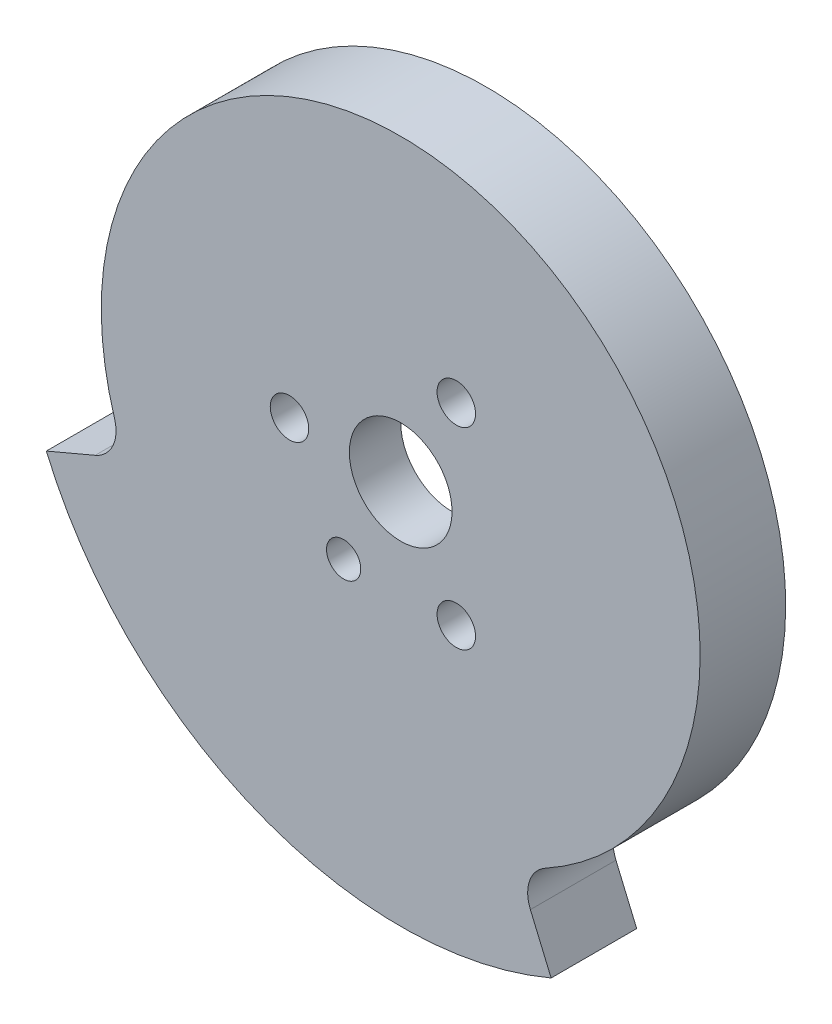
ISO-10303-21;
HEADER;
FILE_DESCRIPTION(('STEP AP214'),'2;1');
FILE_NAME('part.step','',(''),(''),'','','');
FILE_SCHEMA(('AUTOMOTIVE_DESIGN { 1 0 10303 214 1 1 1 1 }'));
ENDSEC;
DATA;
#1=APPLICATION_CONTEXT('core data for automotive mechanical design processes');
#2=APPLICATION_PROTOCOL_DEFINITION('international standard','automotive_design',2000,#1);
#3=PRODUCT_CONTEXT('',#1,'mechanical');
#4=PRODUCT('Part','Part','',(#3));
#5=PRODUCT_RELATED_PRODUCT_CATEGORY('part','',(#4));
#6=PRODUCT_DEFINITION_FORMATION('','',#4);
#7=PRODUCT_DEFINITION_CONTEXT('part definition',#1,'design');
#8=PRODUCT_DEFINITION('design','',#6,#7);
#9=PRODUCT_DEFINITION_SHAPE('','',#8);
#10=(LENGTH_UNIT() NAMED_UNIT(*) SI_UNIT(.MILLI.,.METRE.));
#11=(NAMED_UNIT(*) PLANE_ANGLE_UNIT() SI_UNIT($,.RADIAN.));
#12=(NAMED_UNIT(*) SI_UNIT($,.STERADIAN.) SOLID_ANGLE_UNIT());
#13=UNCERTAINTY_MEASURE_WITH_UNIT(LENGTH_MEASURE(1.E-05),#10,'distance_accuracy_value','');
#14=(GEOMETRIC_REPRESENTATION_CONTEXT(3) GLOBAL_UNCERTAINTY_ASSIGNED_CONTEXT((#13)) GLOBAL_UNIT_ASSIGNED_CONTEXT((#10,
#11,#12)) REPRESENTATION_CONTEXT('',''));
#15=CARTESIAN_POINT('',(0.,0.,0.));
#16=DIRECTION('',(0.,0.,1.));
#17=DIRECTION('',(1.,0.,0.));
#18=AXIS2_PLACEMENT_3D('',#15,#16,#17);
#19=CARTESIAN_POINT('',(-13.,0.,10.));
#20=DIRECTION('',(0.,0.,-1.));
#21=DIRECTION('',(-1.,0.,0.));
#22=AXIS2_PLACEMENT_3D('',#19,#20,#21);
#23=CYLINDRICAL_SURFACE('',#22,2.25);
#24=CARTESIAN_POINT('',(-13.,0.,10.));
#25=DIRECTION('',(0.,0.,1.));
#26=DIRECTION('',(1.,0.,0.));
#27=AXIS2_PLACEMENT_3D('',#24,#25,#26);
#28=CIRCLE('',#27,2.25);
#29=CARTESIAN_POINT('',(-10.75,0.,10.));
#30=VERTEX_POINT('',#29);
#31=EDGE_CURVE('E106',#30,#30,#28,.T.);
#32=ORIENTED_EDGE('',*,*,#31,.T.);
#33=EDGE_LOOP('',(#32));
#34=FACE_BOUND('',#33,.T.);
#35=CARTESIAN_POINT('',(-13.,0.,4.));
#36=DIRECTION('',(0.,0.,-1.));
#37=DIRECTION('',(-1.,0.,0.));
#38=AXIS2_PLACEMENT_3D('',#35,#36,#37);
#39=CIRCLE('',#38,2.25);
#40=CARTESIAN_POINT('',(-15.25,0.,4.));
#41=VERTEX_POINT('',#40);
#42=EDGE_CURVE('E204',#41,#41,#39,.T.);
#43=ORIENTED_EDGE('',*,*,#42,.T.);
#44=EDGE_LOOP('',(#43));
#45=FACE_BOUND('',#44,.T.);
#46=ADVANCED_FACE('F34',(#34,#45),#23,.F.);
#47=CARTESIAN_POINT('',(6.49999999999997,11.2583302491977,10.));
#48=DIRECTION('',(0.,0.,-1.));
#49=DIRECTION('',(-1.,0.,0.));
#50=AXIS2_PLACEMENT_3D('',#47,#48,#49);
#51=CYLINDRICAL_SURFACE('',#50,2.25);
#52=CARTESIAN_POINT('',(6.49999999999997,11.2583302491977,10.));
#53=DIRECTION('',(0.,0.,1.));
#54=DIRECTION('',(1.,0.,0.));
#55=AXIS2_PLACEMENT_3D('',#52,#53,#54);
#56=CIRCLE('',#55,2.25);
#57=CARTESIAN_POINT('',(8.74999999999997,11.2583302491977,10.));
#58=VERTEX_POINT('',#57);
#59=EDGE_CURVE('E109',#58,#58,#56,.T.);
#60=ORIENTED_EDGE('',*,*,#59,.T.);
#61=EDGE_LOOP('',(#60));
#62=FACE_BOUND('',#61,.T.);
#63=CARTESIAN_POINT('',(6.49999999999997,11.2583302491977,4.));
#64=DIRECTION('',(0.,0.,-1.));
#65=DIRECTION('',(-1.,0.,0.));
#66=AXIS2_PLACEMENT_3D('',#63,#64,#65);
#67=CIRCLE('',#66,2.25);
#68=CARTESIAN_POINT('',(4.24999999999997,11.2583302491977,4.));
#69=VERTEX_POINT('',#68);
#70=EDGE_CURVE('E207',#69,#69,#67,.T.);
#71=ORIENTED_EDGE('',*,*,#70,.T.);
#72=EDGE_LOOP('',(#71));
#73=FACE_BOUND('',#72,.T.);
#74=ADVANCED_FACE('F167',(#62,#73),#51,.F.);
#75=CARTESIAN_POINT('',(6.49999999999998,-11.2583302491977,10.));
#76=DIRECTION('',(0.,0.,-1.));
#77=DIRECTION('',(-1.,0.,0.));
#78=AXIS2_PLACEMENT_3D('',#75,#76,#77);
#79=CYLINDRICAL_SURFACE('',#78,2.25);
#80=CARTESIAN_POINT('',(6.49999999999998,-11.2583302491977,10.));
#81=DIRECTION('',(0.,0.,1.));
#82=DIRECTION('',(1.,0.,0.));
#83=AXIS2_PLACEMENT_3D('',#80,#81,#82);
#84=CIRCLE('',#83,2.25);
#85=CARTESIAN_POINT('',(8.74999999999998,-11.2583302491977,10.));
#86=VERTEX_POINT('',#85);
#87=EDGE_CURVE('E196',#86,#86,#84,.T.);
#88=ORIENTED_EDGE('',*,*,#87,.T.);
#89=EDGE_LOOP('',(#88));
#90=FACE_BOUND('',#89,.T.);
#91=CARTESIAN_POINT('',(6.49999999999998,-11.2583302491977,4.));
#92=DIRECTION('',(0.,0.,-1.));
#93=DIRECTION('',(-1.,0.,0.));
#94=AXIS2_PLACEMENT_3D('',#91,#92,#93);
#95=CIRCLE('',#94,2.25);
#96=CARTESIAN_POINT('',(4.24999999999998,-11.2583302491977,4.));
#97=VERTEX_POINT('',#96);
#98=EDGE_CURVE('E210',#97,#97,#95,.T.);
#99=ORIENTED_EDGE('',*,*,#98,.T.);
#100=EDGE_LOOP('',(#99));
#101=FACE_BOUND('',#100,.T.);
#102=ADVANCED_FACE('F173',(#90,#101),#79,.F.);
#103=CARTESIAN_POINT('',(0.,0.,10.));
#104=DIRECTION('',(0.,0.,-1.));
#105=DIRECTION('',(-1.,0.,0.));
#106=AXIS2_PLACEMENT_3D('',#103,#104,#105);
#107=CYLINDRICAL_SURFACE('',#106,6.);
#108=CARTESIAN_POINT('',(0.,0.,10.));
#109=DIRECTION('',(0.,0.,1.));
#110=DIRECTION('',(1.,0.,0.));
#111=AXIS2_PLACEMENT_3D('',#108,#109,#110);
#112=CIRCLE('',#111,6.);
#113=CARTESIAN_POINT('',(6.,0.,10.));
#114=VERTEX_POINT('',#113);
#115=EDGE_CURVE('E193',#114,#114,#112,.T.);
#116=ORIENTED_EDGE('',*,*,#115,.T.);
#117=EDGE_LOOP('',(#116));
#118=FACE_BOUND('',#117,.T.);
#119=CARTESIAN_POINT('',(0.,0.,4.));
#120=DIRECTION('',(0.,0.,-1.));
#121=DIRECTION('',(-1.,0.,0.));
#122=AXIS2_PLACEMENT_3D('',#119,#120,#121);
#123=CIRCLE('',#122,6.);
#124=CARTESIAN_POINT('',(-6.,0.,4.));
#125=VERTEX_POINT('',#124);
#126=EDGE_CURVE('E213',#125,#125,#123,.T.);
#127=ORIENTED_EDGE('',*,*,#126,.T.);
#128=EDGE_LOOP('',(#127));
#129=FACE_BOUND('',#128,.T.);
#130=ADVANCED_FACE('F187',(#118,#129),#107,.F.);
#131=CARTESIAN_POINT('',(-6.67012731053906,-11.1583780927696,10.));
#132=DIRECTION('',(0.,0.,-1.));
#133=DIRECTION('',(-1.,0.,0.));
#134=AXIS2_PLACEMENT_3D('',#131,#132,#133);
#135=CYLINDRICAL_SURFACE('',#134,2.);
#136=CARTESIAN_POINT('',(-6.67012731053906,-11.1583780927696,10.));
#137=DIRECTION('',(0.,0.,1.));
#138=DIRECTION('',(1.,0.,0.));
#139=AXIS2_PLACEMENT_3D('',#136,#137,#138);
#140=CIRCLE('',#139,2.);
#141=CARTESIAN_POINT('',(-4.67012731053906,-11.1583780927696,10.));
#142=VERTEX_POINT('',#141);
#143=EDGE_CURVE('E201',#142,#142,#140,.T.);
#144=ORIENTED_EDGE('',*,*,#143,.T.);
#145=EDGE_LOOP('',(#144));
#146=FACE_BOUND('',#145,.T.);
#147=CARTESIAN_POINT('',(-6.67012731053906,-11.1583780927696,4.));
#148=DIRECTION('',(0.,0.,-1.));
#149=DIRECTION('',(-1.,0.,0.));
#150=AXIS2_PLACEMENT_3D('',#147,#148,#149);
#151=CIRCLE('',#150,2.);
#152=CARTESIAN_POINT('',(-8.67012731053907,-11.1583780927696,4.));
#153=VERTEX_POINT('',#152);
#154=EDGE_CURVE('E38',#153,#153,#151,.T.);
#155=ORIENTED_EDGE('',*,*,#154,.T.);
#156=EDGE_LOOP('',(#155));
#157=FACE_BOUND('',#156,.T.);
#158=ADVANCED_FACE('F182',(#146,#157),#135,.F.);
#159=CARTESIAN_POINT('',(-37.2732930890698,-11.4761327238884,10.));
#160=DIRECTION('',(0.,0.,-1.));
#161=DIRECTION('',(-1.,0.,0.));
#162=AXIS2_PLACEMENT_3D('',#159,#160,#161);
#163=PLANE('',#162);
#164=ORIENTED_EDGE('',*,*,#115,.F.);
#165=EDGE_LOOP('',(#164));
#166=FACE_BOUND('',#165,.T.);
#167=ORIENTED_EDGE('',*,*,#59,.F.);
#168=EDGE_LOOP('',(#167));
#169=FACE_BOUND('',#168,.T.);
#170=CARTESIAN_POINT('',(-37.2732930890698,-11.4761327238884,10.));
#171=DIRECTION('',(0.,0.,-1.));
#172=DIRECTION('',(-1.,0.,0.));
#173=AXIS2_PLACEMENT_3D('',#170,#171,#172);
#174=CIRCLE('',#173,4.);
#175=CARTESIAN_POINT('',(-33.4503912337806,-10.2990934701562,10.));
#176=VERTEX_POINT('',#175);
#177=CARTESIAN_POINT('',(-35.7103685751127,-15.1581521376981,10.));
#178=VERTEX_POINT('',#177);
#179=EDGE_CURVE('E120',#176,#178,#174,.T.);
#180=ORIENTED_EDGE('',*,*,#179,.T.);
#181=DIRECTION('',(-0.920504853452441,-0.390731128489271,0.));
#182=VECTOR('',#181,1.);
#183=CARTESIAN_POINT('',(-35.7103685751127,-15.1581521376981,10.));
#184=LINE('',#183,#182);
#185=CARTESIAN_POINT('',(-41.4227184053599,-17.5829007820172,10.));
#186=VERTEX_POINT('',#185);
#187=EDGE_CURVE('E101',#178,#186,#184,.T.);
#188=ORIENTED_EDGE('',*,*,#187,.T.);
#189=CARTESIAN_POINT('',(0.,0.,10.));
#190=DIRECTION('',(0.,0.,1.));
#191=DIRECTION('',(1.,0.,0.));
#192=AXIS2_PLACEMENT_3D('',#189,#190,#191);
#193=CIRCLE('',#192,45.);
#194=CARTESIAN_POINT('',(17.5829007820172,-41.4227184053599,10.));
#195=VERTEX_POINT('',#194);
#196=EDGE_CURVE('E123',#186,#195,#193,.T.);
#197=ORIENTED_EDGE('',*,*,#196,.T.);
#198=DIRECTION('',(-0.390731128489271,0.920504853452441,0.));
#199=VECTOR('',#198,1.);
#200=CARTESIAN_POINT('',(15.1581521376981,-35.7103685751127,10.));
#201=LINE('',#200,#199);
#202=CARTESIAN_POINT('',(15.1581521376981,-35.7103685751127,10.));
#203=VERTEX_POINT('',#202);
#204=EDGE_CURVE('E125',#195,#203,#201,.T.);
#205=ORIENTED_EDGE('',*,*,#204,.T.);
#206=CARTESIAN_POINT('',(18.8401715515079,-34.1474440611556,10.));
#207=DIRECTION('',(0.,0.,-1.));
#208=DIRECTION('',(1.,0.,0.));
#209=AXIS2_PLACEMENT_3D('',#206,#207,#208);
#210=CIRCLE('',#209,4.);
#211=CARTESIAN_POINT('',(16.9078462641737,-30.6451421061653,10.));
#212=VERTEX_POINT('',#211);
#213=EDGE_CURVE('E55',#203,#212,#210,.T.);
#214=ORIENTED_EDGE('',*,*,#213,.T.);
#215=CARTESIAN_POINT('',(0.,0.,10.));
#216=DIRECTION('',(0.,0.,1.));
#217=DIRECTION('',(1.,0.,0.));
#218=AXIS2_PLACEMENT_3D('',#215,#216,#217);
#219=CIRCLE('',#218,35.);
#220=EDGE_CURVE('E50',#212,#176,#219,.T.);
#221=ORIENTED_EDGE('',*,*,#220,.T.);
#222=EDGE_LOOP('',(#180,#188,#197,#205,#214,#221));
#223=FACE_BOUND('',#222,.T.);
#224=ORIENTED_EDGE('',*,*,#31,.F.);
#225=EDGE_LOOP('',(#224));
#226=FACE_BOUND('',#225,.T.);
#227=ORIENTED_EDGE('',*,*,#87,.F.);
#228=EDGE_LOOP('',(#227));
#229=FACE_BOUND('',#228,.T.);
#230=ORIENTED_EDGE('',*,*,#143,.F.);
#231=EDGE_LOOP('',(#230));
#232=FACE_BOUND('',#231,.T.);
#233=ADVANCED_FACE('F144',(#166,#169,#223,#226,#229,#232),#163,.F.);
#234=CARTESIAN_POINT('',(-37.2732930890698,-11.4761327238884,0.));
#235=DIRECTION('',(0.,0.,-1.));
#236=DIRECTION('',(-1.,0.,0.));
#237=AXIS2_PLACEMENT_3D('',#234,#235,#236);
#238=PLANE('',#237);
#239=CARTESIAN_POINT('',(0.,0.,0.));
#240=DIRECTION('',(0.,0.,-1.));
#241=DIRECTION('',(-1.,0.,0.));
#242=AXIS2_PLACEMENT_3D('',#239,#240,#241);
#243=CIRCLE('',#242,25.);
#244=CARTESIAN_POINT('',(-25.,0.,0.));
#245=VERTEX_POINT('',#244);
#246=EDGE_CURVE('E219',#245,#245,#243,.T.);
#247=ORIENTED_EDGE('',*,*,#246,.F.);
#248=EDGE_LOOP('',(#247));
#249=FACE_BOUND('',#248,.T.);
#250=CARTESIAN_POINT('',(-37.2732930890698,-11.4761327238884,0.));
#251=DIRECTION('',(0.,0.,-1.));
#252=DIRECTION('',(-1.,0.,0.));
#253=AXIS2_PLACEMENT_3D('',#250,#251,#252);
#254=CIRCLE('',#253,4.);
#255=CARTESIAN_POINT('',(-33.4503912337806,-10.2990934701562,0.));
#256=VERTEX_POINT('',#255);
#257=CARTESIAN_POINT('',(-35.7103685751127,-15.1581521376981,0.));
#258=VERTEX_POINT('',#257);
#259=EDGE_CURVE('E92',#256,#258,#254,.T.);
#260=ORIENTED_EDGE('',*,*,#259,.F.);
#261=CARTESIAN_POINT('',(0.,0.,0.));
#262=DIRECTION('',(0.,0.,1.));
#263=DIRECTION('',(1.,0.,0.));
#264=AXIS2_PLACEMENT_3D('',#261,#262,#263);
#265=CIRCLE('',#264,35.);
#266=CARTESIAN_POINT('',(16.9078462641737,-30.6451421061653,0.));
#267=VERTEX_POINT('',#266);
#268=EDGE_CURVE('E118',#267,#256,#265,.T.);
#269=ORIENTED_EDGE('',*,*,#268,.F.);
#270=CARTESIAN_POINT('',(18.8401715515079,-34.1474440611556,0.));
#271=DIRECTION('',(0.,0.,-1.));
#272=DIRECTION('',(1.,0.,0.));
#273=AXIS2_PLACEMENT_3D('',#270,#271,#272);
#274=CIRCLE('',#273,4.);
#275=CARTESIAN_POINT('',(15.1581521376981,-35.7103685751127,0.));
#276=VERTEX_POINT('',#275);
#277=EDGE_CURVE('E116',#276,#267,#274,.T.);
#278=ORIENTED_EDGE('',*,*,#277,.F.);
#279=DIRECTION('',(-0.390731128489271,0.920504853452441,0.));
#280=VECTOR('',#279,1.);
#281=CARTESIAN_POINT('',(15.1581521376981,-35.7103685751127,0.));
#282=LINE('',#281,#280);
#283=CARTESIAN_POINT('',(17.5829007820172,-41.4227184053599,0.));
#284=VERTEX_POINT('',#283);
#285=EDGE_CURVE('E114',#284,#276,#282,.T.);
#286=ORIENTED_EDGE('',*,*,#285,.F.);
#287=CARTESIAN_POINT('',(0.,0.,0.));
#288=DIRECTION('',(0.,0.,1.));
#289=DIRECTION('',(1.,0.,0.));
#290=AXIS2_PLACEMENT_3D('',#287,#288,#289);
#291=CIRCLE('',#290,45.);
#292=CARTESIAN_POINT('',(-41.4227184053599,-17.5829007820172,0.));
#293=VERTEX_POINT('',#292);
#294=EDGE_CURVE('E94',#293,#284,#291,.T.);
#295=ORIENTED_EDGE('',*,*,#294,.F.);
#296=DIRECTION('',(-0.920504853452441,-0.390731128489271,0.));
#297=VECTOR('',#296,1.);
#298=CARTESIAN_POINT('',(-35.7103685751127,-15.1581521376981,0.));
#299=LINE('',#298,#297);
#300=EDGE_CURVE('E88',#258,#293,#299,.T.);
#301=ORIENTED_EDGE('',*,*,#300,.F.);
#302=EDGE_LOOP('',(#260,#269,#278,#286,#295,#301));
#303=FACE_BOUND('',#302,.T.);
#304=ADVANCED_FACE('F89',(#249,#303),#238,.T.);
#305=CARTESIAN_POINT('',(-37.2732930890698,-11.4761327238884,10.));
#306=DIRECTION('',(0.,0.,-1.));
#307=DIRECTION('',(-1.,0.,0.));
#308=AXIS2_PLACEMENT_3D('',#305,#306,#307);
#309=CYLINDRICAL_SURFACE('',#308,4.);
#310=ORIENTED_EDGE('',*,*,#259,.T.);
#311=DIRECTION('',(0.,0.,-1.));
#312=VECTOR('',#311,1.);
#313=CARTESIAN_POINT('',(-35.7103685751127,-15.1581521376981,10.));
#314=LINE('',#313,#312);
#315=EDGE_CURVE('E11',#178,#258,#314,.T.);
#316=ORIENTED_EDGE('',*,*,#315,.F.);
#317=ORIENTED_EDGE('',*,*,#179,.F.);
#318=DIRECTION('',(0.,0.,-1.));
#319=VECTOR('',#318,1.);
#320=CARTESIAN_POINT('',(-33.4503912337806,-10.2990934701562,10.));
#321=LINE('',#320,#319);
#322=EDGE_CURVE('E105',#176,#256,#321,.T.);
#323=ORIENTED_EDGE('',*,*,#322,.T.);
#324=EDGE_LOOP('',(#310,#316,#317,#323));
#325=FACE_BOUND('',#324,.T.);
#326=ADVANCED_FACE('F36',(#325),#309,.F.);
#327=CARTESIAN_POINT('',(-35.7103685751127,-15.1581521376981,10.));
#328=DIRECTION('',(0.390731128489271,-0.920504853452441,0.));
#329=DIRECTION('',(0.920504853452441,0.390731128489271,0.));
#330=AXIS2_PLACEMENT_3D('',#327,#328,#329);
#331=PLANE('',#330);
#332=ORIENTED_EDGE('',*,*,#300,.T.);
#333=DIRECTION('',(0.,0.,-1.));
#334=VECTOR('',#333,1.);
#335=CARTESIAN_POINT('',(-41.4227184053599,-17.5829007820172,10.));
#336=LINE('',#335,#334);
#337=EDGE_CURVE('E43',#186,#293,#336,.T.);
#338=ORIENTED_EDGE('',*,*,#337,.F.);
#339=ORIENTED_EDGE('',*,*,#187,.F.);
#340=ORIENTED_EDGE('',*,*,#315,.T.);
#341=EDGE_LOOP('',(#332,#338,#339,#340));
#342=FACE_BOUND('',#341,.T.);
#343=ADVANCED_FACE('F100',(#342),#331,.F.);
#344=CARTESIAN_POINT('',(0.,0.,10.));
#345=DIRECTION('',(0.,0.,-1.));
#346=DIRECTION('',(-1.,0.,0.));
#347=AXIS2_PLACEMENT_3D('',#344,#345,#346);
#348=CYLINDRICAL_SURFACE('',#347,45.);
#349=ORIENTED_EDGE('',*,*,#294,.T.);
#350=DIRECTION('',(0.,0.,-1.));
#351=VECTOR('',#350,1.);
#352=CARTESIAN_POINT('',(17.5829007820172,-41.4227184053599,10.));
#353=LINE('',#352,#351);
#354=EDGE_CURVE('E136',#195,#284,#353,.T.);
#355=ORIENTED_EDGE('',*,*,#354,.F.);
#356=ORIENTED_EDGE('',*,*,#196,.F.);
#357=ORIENTED_EDGE('',*,*,#337,.T.);
#358=EDGE_LOOP('',(#349,#355,#356,#357));
#359=FACE_BOUND('',#358,.T.);
#360=ADVANCED_FACE('F141',(#359),#348,.T.);
#361=CARTESIAN_POINT('',(15.1581521376981,-35.7103685751127,10.));
#362=DIRECTION('',(-0.920504853452441,-0.390731128489271,0.));
#363=DIRECTION('',(0.390731128489271,-0.920504853452441,0.));
#364=AXIS2_PLACEMENT_3D('',#361,#362,#363);
#365=PLANE('',#364);
#366=ORIENTED_EDGE('',*,*,#285,.T.);
#367=DIRECTION('',(0.,0.,-1.));
#368=VECTOR('',#367,1.);
#369=CARTESIAN_POINT('',(15.1581521376981,-35.7103685751127,10.));
#370=LINE('',#369,#368);
#371=EDGE_CURVE('E133',#203,#276,#370,.T.);
#372=ORIENTED_EDGE('',*,*,#371,.F.);
#373=ORIENTED_EDGE('',*,*,#204,.F.);
#374=ORIENTED_EDGE('',*,*,#354,.T.);
#375=EDGE_LOOP('',(#366,#372,#373,#374));
#376=FACE_BOUND('',#375,.T.);
#377=ADVANCED_FACE('F148',(#376),#365,.F.);
#378=CARTESIAN_POINT('',(18.8401715515079,-34.1474440611556,10.));
#379=DIRECTION('',(0.,0.,-1.));
#380=DIRECTION('',(-1.,0.,0.));
#381=AXIS2_PLACEMENT_3D('',#378,#379,#380);
#382=CYLINDRICAL_SURFACE('',#381,4.);
#383=ORIENTED_EDGE('',*,*,#277,.T.);
#384=DIRECTION('',(0.,0.,-1.));
#385=VECTOR('',#384,1.);
#386=CARTESIAN_POINT('',(16.9078462641737,-30.6451421061653,10.));
#387=LINE('',#386,#385);
#388=EDGE_CURVE('E130',#212,#267,#387,.T.);
#389=ORIENTED_EDGE('',*,*,#388,.F.);
#390=ORIENTED_EDGE('',*,*,#213,.F.);
#391=ORIENTED_EDGE('',*,*,#371,.T.);
#392=EDGE_LOOP('',(#383,#389,#390,#391));
#393=FACE_BOUND('',#392,.T.);
#394=ADVANCED_FACE('F151',(#393),#382,.F.);
#395=CARTESIAN_POINT('',(0.,0.,10.));
#396=DIRECTION('',(0.,0.,-1.));
#397=DIRECTION('',(-1.,0.,0.));
#398=AXIS2_PLACEMENT_3D('',#395,#396,#397);
#399=CYLINDRICAL_SURFACE('',#398,35.);
#400=ORIENTED_EDGE('',*,*,#268,.T.);
#401=ORIENTED_EDGE('',*,*,#322,.F.);
#402=ORIENTED_EDGE('',*,*,#220,.F.);
#403=ORIENTED_EDGE('',*,*,#388,.T.);
#404=EDGE_LOOP('',(#400,#401,#402,#403));
#405=FACE_BOUND('',#404,.T.);
#406=ADVANCED_FACE('F153',(#405),#399,.T.);
#407=CARTESIAN_POINT('',(0.,0.,4.));
#408=DIRECTION('',(0.,0.,-1.));
#409=DIRECTION('',(-1.,0.,0.));
#410=AXIS2_PLACEMENT_3D('',#407,#408,#409);
#411=CYLINDRICAL_SURFACE('',#410,25.);
#412=CARTESIAN_POINT('',(0.,0.,4.));
#413=DIRECTION('',(0.,0.,-1.));
#414=DIRECTION('',(-1.,0.,0.));
#415=AXIS2_PLACEMENT_3D('',#412,#413,#414);
#416=CIRCLE('',#415,25.);
#417=CARTESIAN_POINT('',(-25.,0.,4.));
#418=VERTEX_POINT('',#417);
#419=EDGE_CURVE('E216',#418,#418,#416,.T.);
#420=ORIENTED_EDGE('',*,*,#419,.F.);
#421=EDGE_LOOP('',(#420));
#422=FACE_BOUND('',#421,.T.);
#423=ORIENTED_EDGE('',*,*,#246,.T.);
#424=EDGE_LOOP('',(#423));
#425=FACE_BOUND('',#424,.T.);
#426=ADVANCED_FACE('F155',(#422,#425),#411,.F.);
#427=CARTESIAN_POINT('',(0.,0.,4.));
#428=DIRECTION('',(0.,0.,-1.));
#429=DIRECTION('',(-1.,0.,0.));
#430=AXIS2_PLACEMENT_3D('',#427,#428,#429);
#431=PLANE('',#430);
#432=ORIENTED_EDGE('',*,*,#42,.F.);
#433=EDGE_LOOP('',(#432));
#434=FACE_BOUND('',#433,.T.);
#435=ORIENTED_EDGE('',*,*,#70,.F.);
#436=EDGE_LOOP('',(#435));
#437=FACE_BOUND('',#436,.T.);
#438=ORIENTED_EDGE('',*,*,#98,.F.);
#439=EDGE_LOOP('',(#438));
#440=FACE_BOUND('',#439,.T.);
#441=ORIENTED_EDGE('',*,*,#126,.F.);
#442=EDGE_LOOP('',(#441));
#443=FACE_BOUND('',#442,.T.);
#444=ORIENTED_EDGE('',*,*,#154,.F.);
#445=EDGE_LOOP('',(#444));
#446=FACE_BOUND('',#445,.T.);
#447=ORIENTED_EDGE('',*,*,#419,.T.);
#448=EDGE_LOOP('',(#447));
#449=FACE_BOUND('',#448,.T.);
#450=ADVANCED_FACE('F161',(#434,#437,#440,#443,#446,#449),#431,.T.);
#451=CLOSED_SHELL('',(#46,#74,#102,#130,#158,#233,#304,#326,#343,#360,#377,#394,#406,#426,#450));
#452=MANIFOLD_SOLID_BREP('B2',#451);
#453=ADVANCED_BREP_SHAPE_REPRESENTATION('',(#18,#452),#14);
#454=SHAPE_DEFINITION_REPRESENTATION(#9,#453);
ENDSEC;
END-ISO-10303-21;
